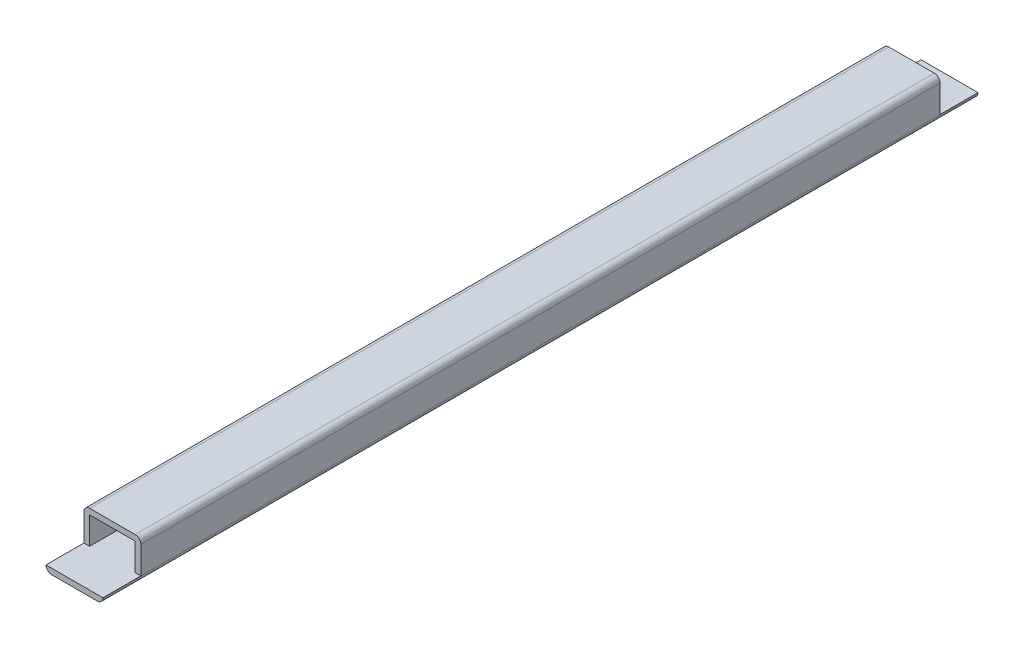
ISO-10303-21;
HEADER;
FILE_DESCRIPTION(('STEP AP214'),'2;1');
FILE_NAME('part.step','',(''),(''),'','','');
FILE_SCHEMA(('AUTOMOTIVE_DESIGN { 1 0 10303 214 1 1 1 1 }'));
ENDSEC;
DATA;
#1=APPLICATION_CONTEXT('core data for automotive mechanical design processes');
#2=APPLICATION_PROTOCOL_DEFINITION('international standard','automotive_design',2000,#1);
#3=PRODUCT_CONTEXT('',#1,'mechanical');
#4=PRODUCT('Part','Part','',(#3));
#5=PRODUCT_RELATED_PRODUCT_CATEGORY('part','',(#4));
#6=PRODUCT_DEFINITION_FORMATION('','',#4);
#7=PRODUCT_DEFINITION_CONTEXT('part definition',#1,'design');
#8=PRODUCT_DEFINITION('design','',#6,#7);
#9=PRODUCT_DEFINITION_SHAPE('','',#8);
#10=(LENGTH_UNIT() NAMED_UNIT(*) SI_UNIT(.MILLI.,.METRE.));
#11=(NAMED_UNIT(*) PLANE_ANGLE_UNIT() SI_UNIT($,.RADIAN.));
#12=(NAMED_UNIT(*) SI_UNIT($,.STERADIAN.) SOLID_ANGLE_UNIT());
#13=UNCERTAINTY_MEASURE_WITH_UNIT(LENGTH_MEASURE(1.E-05),#10,'distance_accuracy_value','');
#14=(GEOMETRIC_REPRESENTATION_CONTEXT(3) GLOBAL_UNCERTAINTY_ASSIGNED_CONTEXT((#13)) GLOBAL_UNIT_ASSIGNED_CONTEXT((#10,
#11,#12)) REPRESENTATION_CONTEXT('',''));
#15=CARTESIAN_POINT('',(0.,0.,0.));
#16=DIRECTION('',(0.,0.,1.));
#17=DIRECTION('',(1.,0.,0.));
#18=AXIS2_PLACEMENT_3D('',#15,#16,#17);
#19=CARTESIAN_POINT('',(3.,17.34,461.));
#20=DIRECTION('',(0.,0.,-1.));
#21=DIRECTION('',(-1.,0.,0.));
#22=AXIS2_PLACEMENT_3D('',#19,#20,#21);
#23=CYLINDRICAL_SURFACE('',#22,3.);
#24=CARTESIAN_POINT('',(3.,17.34,20.));
#25=DIRECTION('',(0.,0.,-1.));
#26=DIRECTION('',(-1.,0.,0.));
#27=AXIS2_PLACEMENT_3D('',#24,#25,#26);
#28=CIRCLE('',#27,3.);
#29=CARTESIAN_POINT('',(0.,17.34,20.));
#30=VERTEX_POINT('',#29);
#31=CARTESIAN_POINT('',(3.,20.34,20.));
#32=VERTEX_POINT('',#31);
#33=EDGE_CURVE('E243',#30,#32,#28,.T.);
#34=ORIENTED_EDGE('',*,*,#33,.F.);
#35=DIRECTION('',(0.,0.,-1.));
#36=VECTOR('',#35,1.);
#37=CARTESIAN_POINT('',(0.,17.34,461.));
#38=LINE('',#37,#36);
#39=CARTESIAN_POINT('',(0.,17.34,441.));
#40=VERTEX_POINT('',#39);
#41=EDGE_CURVE('E11',#40,#30,#38,.T.);
#42=ORIENTED_EDGE('',*,*,#41,.F.);
#43=CARTESIAN_POINT('',(3.,17.34,441.));
#44=DIRECTION('',(0.,0.,1.));
#45=DIRECTION('',(-1.,0.,0.));
#46=AXIS2_PLACEMENT_3D('',#43,#44,#45);
#47=CIRCLE('',#46,3.);
#48=CARTESIAN_POINT('',(3.,20.34,441.));
#49=VERTEX_POINT('',#48);
#50=EDGE_CURVE('E285',#49,#40,#47,.T.);
#51=ORIENTED_EDGE('',*,*,#50,.F.);
#52=DIRECTION('',(0.,0.,-1.));
#53=VECTOR('',#52,1.);
#54=CARTESIAN_POINT('',(3.,20.34,461.));
#55=LINE('',#54,#53);
#56=EDGE_CURVE('E189',#49,#32,#55,.T.);
#57=ORIENTED_EDGE('',*,*,#56,.T.);
#58=EDGE_LOOP('',(#34,#42,#51,#57));
#59=FACE_BOUND('',#58,.T.);
#60=ADVANCED_FACE('F42',(#59),#23,.T.);
#61=CARTESIAN_POINT('',(0.,3.00000000000002,461.));
#62=DIRECTION('',(1.,0.,0.));
#63=DIRECTION('',(0.,0.,-1.));
#64=AXIS2_PLACEMENT_3D('',#61,#62,#63);
#65=PLANE('',#64);
#66=DIRECTION('',(0.,1.,0.));
#67=VECTOR('',#66,1.);
#68=CARTESIAN_POINT('',(0.,3.00000000000002,20.));
#69=LINE('',#68,#67);
#70=CARTESIAN_POINT('',(0.,3.00000000000002,20.));
#71=VERTEX_POINT('',#70);
#72=EDGE_CURVE('E239',#71,#30,#69,.T.);
#73=ORIENTED_EDGE('',*,*,#72,.F.);
#74=DIRECTION('',(0.,0.,-1.));
#75=VECTOR('',#74,1.);
#76=CARTESIAN_POINT('',(0.,3.00000000000002,461.));
#77=LINE('',#76,#75);
#78=CARTESIAN_POINT('',(0.,3.00000000000002,441.));
#79=VERTEX_POINT('',#78);
#80=EDGE_CURVE('E220',#79,#71,#77,.T.);
#81=ORIENTED_EDGE('',*,*,#80,.F.);
#82=DIRECTION('',(0.,-1.,0.));
#83=VECTOR('',#82,1.);
#84=CARTESIAN_POINT('',(0.,3.00000000000002,441.));
#85=LINE('',#84,#83);
#86=EDGE_CURVE('E237',#40,#79,#85,.T.);
#87=ORIENTED_EDGE('',*,*,#86,.F.);
#88=ORIENTED_EDGE('',*,*,#41,.T.);
#89=EDGE_LOOP('',(#73,#81,#87,#88));
#90=FACE_BOUND('',#89,.T.);
#91=ADVANCED_FACE('F236',(#90),#65,.F.);
#92=CARTESIAN_POINT('',(30.,3.00000000000002,461.));
#93=DIRECTION('',(-1.,0.,0.));
#94=DIRECTION('',(0.,0.,1.));
#95=AXIS2_PLACEMENT_3D('',#92,#93,#94);
#96=PLANE('',#95);
#97=DIRECTION('',(0.,-1.,0.));
#98=VECTOR('',#97,1.);
#99=CARTESIAN_POINT('',(30.,17.34,20.));
#100=LINE('',#99,#98);
#101=CARTESIAN_POINT('',(30.,17.34,20.));
#102=VERTEX_POINT('',#101);
#103=CARTESIAN_POINT('',(30.,3.00000000000002,20.));
#104=VERTEX_POINT('',#103);
#105=EDGE_CURVE('E144',#102,#104,#100,.T.);
#106=ORIENTED_EDGE('',*,*,#105,.F.);
#107=DIRECTION('',(0.,0.,-1.));
#108=VECTOR('',#107,1.);
#109=CARTESIAN_POINT('',(30.,17.34,461.));
#110=LINE('',#109,#108);
#111=CARTESIAN_POINT('',(30.,17.34,441.));
#112=VERTEX_POINT('',#111);
#113=EDGE_CURVE('E205',#112,#102,#110,.T.);
#114=ORIENTED_EDGE('',*,*,#113,.F.);
#115=DIRECTION('',(0.,1.,0.));
#116=VECTOR('',#115,1.);
#117=CARTESIAN_POINT('',(30.,17.34,441.));
#118=LINE('',#117,#116);
#119=CARTESIAN_POINT('',(30.,3.00000000000002,441.));
#120=VERTEX_POINT('',#119);
#121=EDGE_CURVE('E276',#120,#112,#118,.T.);
#122=ORIENTED_EDGE('',*,*,#121,.F.);
#123=DIRECTION('',(0.,0.,-1.));
#124=VECTOR('',#123,1.);
#125=CARTESIAN_POINT('',(30.,3.00000000000002,461.));
#126=LINE('',#125,#124);
#127=EDGE_CURVE('E209',#120,#104,#126,.T.);
#128=ORIENTED_EDGE('',*,*,#127,.T.);
#129=EDGE_LOOP('',(#106,#114,#122,#128));
#130=FACE_BOUND('',#129,.T.);
#131=ADVANCED_FACE('F341',(#130),#96,.F.);
#132=CARTESIAN_POINT('',(27.,17.34,461.));
#133=DIRECTION('',(0.,0.,-1.));
#134=DIRECTION('',(-1.,0.,0.));
#135=AXIS2_PLACEMENT_3D('',#132,#133,#134);
#136=CYLINDRICAL_SURFACE('',#135,3.);
#137=CARTESIAN_POINT('',(27.,17.34,20.));
#138=DIRECTION('',(0.,0.,-1.));
#139=DIRECTION('',(-1.,0.,0.));
#140=AXIS2_PLACEMENT_3D('',#137,#138,#139);
#141=CIRCLE('',#140,3.00000000000002);
#142=CARTESIAN_POINT('',(27.,20.34,20.));
#143=VERTEX_POINT('',#142);
#144=EDGE_CURVE('E256',#143,#102,#141,.T.);
#145=ORIENTED_EDGE('',*,*,#144,.F.);
#146=DIRECTION('',(0.,0.,-1.));
#147=VECTOR('',#146,1.);
#148=CARTESIAN_POINT('',(27.,20.34,461.));
#149=LINE('',#148,#147);
#150=CARTESIAN_POINT('',(27.,20.34,441.));
#151=VERTEX_POINT('',#150);
#152=EDGE_CURVE('E201',#151,#143,#149,.T.);
#153=ORIENTED_EDGE('',*,*,#152,.F.);
#154=CARTESIAN_POINT('',(27.,17.34,441.));
#155=DIRECTION('',(0.,0.,1.));
#156=DIRECTION('',(-1.,0.,0.));
#157=AXIS2_PLACEMENT_3D('',#154,#155,#156);
#158=CIRCLE('',#157,3.00000000000002);
#159=EDGE_CURVE('E279',#112,#151,#158,.T.);
#160=ORIENTED_EDGE('',*,*,#159,.F.);
#161=ORIENTED_EDGE('',*,*,#113,.T.);
#162=EDGE_LOOP('',(#145,#153,#160,#161));
#163=FACE_BOUND('',#162,.T.);
#164=ADVANCED_FACE('F336',(#163),#136,.T.);
#165=CARTESIAN_POINT('',(3.,20.34,461.));
#166=DIRECTION('',(0.,-1.,0.));
#167=DIRECTION('',(1.,0.,0.));
#168=AXIS2_PLACEMENT_3D('',#165,#166,#167);
#169=PLANE('',#168);
#170=DIRECTION('',(1.,0.,0.));
#171=VECTOR('',#170,1.);
#172=CARTESIAN_POINT('',(3.,20.34,20.));
#173=LINE('',#172,#171);
#174=EDGE_CURVE('E248',#32,#143,#173,.T.);
#175=ORIENTED_EDGE('',*,*,#174,.F.);
#176=ORIENTED_EDGE('',*,*,#56,.F.);
#177=DIRECTION('',(-1.,0.,0.));
#178=VECTOR('',#177,1.);
#179=CARTESIAN_POINT('',(3.,20.34,441.));
#180=LINE('',#179,#178);
#181=EDGE_CURVE('E282',#151,#49,#180,.T.);
#182=ORIENTED_EDGE('',*,*,#181,.F.);
#183=ORIENTED_EDGE('',*,*,#152,.T.);
#184=EDGE_LOOP('',(#175,#176,#182,#183));
#185=FACE_BOUND('',#184,.T.);
#186=ADVANCED_FACE('F332',(#185),#169,.F.);
#187=CARTESIAN_POINT('',(3.,3.,461.));
#188=DIRECTION('',(1.,0.,0.));
#189=DIRECTION('',(0.,1.,0.));
#190=AXIS2_PLACEMENT_3D('',#187,#188,#189);
#191=PLANE('',#190);
#192=DIRECTION('',(0.,0.,-1.));
#193=VECTOR('',#192,1.);
#194=CARTESIAN_POINT('',(3.,3.,461.));
#195=LINE('',#194,#193);
#196=CARTESIAN_POINT('',(3.,3.,441.));
#197=VERTEX_POINT('',#196);
#198=CARTESIAN_POINT('',(3.,3.,20.));
#199=VERTEX_POINT('',#198);
#200=EDGE_CURVE('E167',#197,#199,#195,.T.);
#201=ORIENTED_EDGE('',*,*,#200,.T.);
#202=DIRECTION('',(0.,-1.,0.));
#203=VECTOR('',#202,1.);
#204=CARTESIAN_POINT('',(3.,17.34,20.));
#205=LINE('',#204,#203);
#206=CARTESIAN_POINT('',(3.,17.34,20.));
#207=VERTEX_POINT('',#206);
#208=EDGE_CURVE('E250',#207,#199,#205,.T.);
#209=ORIENTED_EDGE('',*,*,#208,.F.);
#210=DIRECTION('',(0.,0.,-1.));
#211=VECTOR('',#210,1.);
#212=CARTESIAN_POINT('',(3.,17.34,461.));
#213=LINE('',#212,#211);
#214=CARTESIAN_POINT('',(3.,17.34,441.));
#215=VERTEX_POINT('',#214);
#216=EDGE_CURVE('E174',#215,#207,#213,.T.);
#217=ORIENTED_EDGE('',*,*,#216,.F.);
#218=DIRECTION('',(0.,1.,0.));
#219=VECTOR('',#218,1.);
#220=CARTESIAN_POINT('',(3.,17.34,441.));
#221=LINE('',#220,#219);
#222=EDGE_CURVE('E65',#197,#215,#221,.T.);
#223=ORIENTED_EDGE('',*,*,#222,.F.);
#224=EDGE_LOOP('',(#201,#209,#217,#223));
#225=FACE_BOUND('',#224,.T.);
#226=ADVANCED_FACE('F305',(#225),#191,.T.);
#227=CARTESIAN_POINT('',(27.,17.34,461.));
#228=DIRECTION('',(-1.,0.,0.));
#229=DIRECTION('',(0.,0.,1.));
#230=AXIS2_PLACEMENT_3D('',#227,#228,#229);
#231=PLANE('',#230);
#232=DIRECTION('',(0.,0.,-1.));
#233=VECTOR('',#232,1.);
#234=CARTESIAN_POINT('',(27.,17.34,461.));
#235=LINE('',#234,#233);
#236=CARTESIAN_POINT('',(27.,17.34,441.));
#237=VERTEX_POINT('',#236);
#238=CARTESIAN_POINT('',(27.,17.34,20.));
#239=VERTEX_POINT('',#238);
#240=EDGE_CURVE('E158',#237,#239,#235,.T.);
#241=ORIENTED_EDGE('',*,*,#240,.T.);
#242=DIRECTION('',(0.,1.,0.));
#243=VECTOR('',#242,1.);
#244=CARTESIAN_POINT('',(27.,3.,20.));
#245=LINE('',#244,#243);
#246=CARTESIAN_POINT('',(27.,3.,20.));
#247=VERTEX_POINT('',#246);
#248=EDGE_CURVE('E57',#247,#239,#245,.T.);
#249=ORIENTED_EDGE('',*,*,#248,.F.);
#250=DIRECTION('',(0.,0.,-1.));
#251=VECTOR('',#250,1.);
#252=CARTESIAN_POINT('',(27.,3.,461.));
#253=LINE('',#252,#251);
#254=CARTESIAN_POINT('',(27.,3.,441.));
#255=VERTEX_POINT('',#254);
#256=EDGE_CURVE('E156',#255,#247,#253,.T.);
#257=ORIENTED_EDGE('',*,*,#256,.F.);
#258=DIRECTION('',(0.,-1.,0.));
#259=VECTOR('',#258,1.);
#260=CARTESIAN_POINT('',(27.,3.,441.));
#261=LINE('',#260,#259);
#262=EDGE_CURVE('E271',#237,#255,#261,.T.);
#263=ORIENTED_EDGE('',*,*,#262,.F.);
#264=EDGE_LOOP('',(#241,#249,#257,#263));
#265=FACE_BOUND('',#264,.T.);
#266=ADVANCED_FACE('F154',(#265),#231,.T.);
#267=CARTESIAN_POINT('',(3.,17.34,461.));
#268=DIRECTION('',(0.,-1.,0.));
#269=DIRECTION('',(0.,0.,-1.));
#270=AXIS2_PLACEMENT_3D('',#267,#268,#269);
#271=PLANE('',#270);
#272=ORIENTED_EDGE('',*,*,#216,.T.);
#273=DIRECTION('',(-1.,0.,0.));
#274=VECTOR('',#273,1.);
#275=CARTESIAN_POINT('',(27.,17.34,20.));
#276=LINE('',#275,#274);
#277=EDGE_CURVE('E160',#239,#207,#276,.T.);
#278=ORIENTED_EDGE('',*,*,#277,.F.);
#279=ORIENTED_EDGE('',*,*,#240,.F.);
#280=DIRECTION('',(1.,0.,0.));
#281=VECTOR('',#280,1.);
#282=CARTESIAN_POINT('',(27.,17.34,441.));
#283=LINE('',#282,#281);
#284=EDGE_CURVE('E268',#215,#237,#283,.T.);
#285=ORIENTED_EDGE('',*,*,#284,.F.);
#286=EDGE_LOOP('',(#272,#278,#279,#285));
#287=FACE_BOUND('',#286,.T.);
#288=ADVANCED_FACE('F302',(#287),#271,.T.);
#289=CARTESIAN_POINT('',(3.,17.34,461.));
#290=DIRECTION('',(0.,0.,1.));
#291=DIRECTION('',(1.,0.,0.));
#292=AXIS2_PLACEMENT_3D('',#289,#290,#291);
#293=PLANE('',#292);
#294=DIRECTION('',(1.,0.,0.));
#295=VECTOR('',#294,1.);
#296=CARTESIAN_POINT('',(27.,3.,461.));
#297=LINE('',#296,#295);
#298=CARTESIAN_POINT('',(0.,3.00000000000002,461.));
#299=VERTEX_POINT('',#298);
#300=CARTESIAN_POINT('',(30.,3.00000000000002,461.));
#301=VERTEX_POINT('',#300);
#302=EDGE_CURVE('E294',#299,#301,#297,.T.);
#303=ORIENTED_EDGE('',*,*,#302,.F.);
#304=CARTESIAN_POINT('',(3.,3.,461.));
#305=DIRECTION('',(0.,0.,1.));
#306=DIRECTION('',(1.,0.,0.));
#307=AXIS2_PLACEMENT_3D('',#304,#305,#306);
#308=CIRCLE('',#307,3.);
#309=CARTESIAN_POINT('',(3.00000000000002,0.,461.));
#310=VERTEX_POINT('',#309);
#311=EDGE_CURVE('E178',#299,#310,#308,.T.);
#312=ORIENTED_EDGE('',*,*,#311,.T.);
#313=DIRECTION('',(1.,0.,0.));
#314=VECTOR('',#313,1.);
#315=CARTESIAN_POINT('',(3.00000000000002,0.,461.));
#316=LINE('',#315,#314);
#317=CARTESIAN_POINT('',(27.,0.,461.));
#318=VERTEX_POINT('',#317);
#319=EDGE_CURVE('E181',#310,#318,#316,.T.);
#320=ORIENTED_EDGE('',*,*,#319,.T.);
#321=CARTESIAN_POINT('',(27.,3.,461.));
#322=DIRECTION('',(0.,0.,1.));
#323=DIRECTION('',(1.,0.,0.));
#324=AXIS2_PLACEMENT_3D('',#321,#322,#323);
#325=CIRCLE('',#324,3.);
#326=EDGE_CURVE('E185',#318,#301,#325,.T.);
#327=ORIENTED_EDGE('',*,*,#326,.T.);
#328=EDGE_LOOP('',(#303,#312,#320,#327));
#329=FACE_BOUND('',#328,.T.);
#330=ADVANCED_FACE('F323',(#329),#293,.T.);
#331=CARTESIAN_POINT('',(3.,17.34,0.));
#332=DIRECTION('',(0.,0.,1.));
#333=DIRECTION('',(1.,0.,0.));
#334=AXIS2_PLACEMENT_3D('',#331,#332,#333);
#335=PLANE('',#334);
#336=DIRECTION('',(1.,0.,0.));
#337=VECTOR('',#336,1.);
#338=CARTESIAN_POINT('',(27.,3.,0.));
#339=LINE('',#338,#337);
#340=CARTESIAN_POINT('',(0.,3.00000000000002,0.));
#341=VERTEX_POINT('',#340);
#342=CARTESIAN_POINT('',(30.,3.00000000000002,0.));
#343=VERTEX_POINT('',#342);
#344=EDGE_CURVE('E293',#341,#343,#339,.T.);
#345=ORIENTED_EDGE('',*,*,#344,.T.);
#346=CARTESIAN_POINT('',(27.,3.,0.));
#347=DIRECTION('',(0.,0.,1.));
#348=DIRECTION('',(1.,0.,0.));
#349=AXIS2_PLACEMENT_3D('',#346,#347,#348);
#350=CIRCLE('',#349,3.);
#351=CARTESIAN_POINT('',(27.,0.,0.));
#352=VERTEX_POINT('',#351);
#353=EDGE_CURVE('E182',#352,#343,#350,.T.);
#354=ORIENTED_EDGE('',*,*,#353,.F.);
#355=DIRECTION('',(1.,0.,0.));
#356=VECTOR('',#355,1.);
#357=CARTESIAN_POINT('',(3.00000000000002,0.,0.));
#358=LINE('',#357,#356);
#359=CARTESIAN_POINT('',(3.00000000000002,0.,0.));
#360=VERTEX_POINT('',#359);
#361=EDGE_CURVE('E192',#360,#352,#358,.T.);
#362=ORIENTED_EDGE('',*,*,#361,.F.);
#363=CARTESIAN_POINT('',(3.,3.,0.));
#364=DIRECTION('',(0.,0.,1.));
#365=DIRECTION('',(1.,0.,0.));
#366=AXIS2_PLACEMENT_3D('',#363,#364,#365);
#367=CIRCLE('',#366,3.);
#368=EDGE_CURVE('E172',#341,#360,#367,.T.);
#369=ORIENTED_EDGE('',*,*,#368,.F.);
#370=EDGE_LOOP('',(#345,#354,#362,#369));
#371=FACE_BOUND('',#370,.T.);
#372=ADVANCED_FACE('F314',(#371),#335,.F.);
#373=CARTESIAN_POINT('',(3.,3.,461.));
#374=DIRECTION('',(0.,0.,-1.));
#375=DIRECTION('',(-1.,0.,0.));
#376=AXIS2_PLACEMENT_3D('',#373,#374,#375);
#377=CYLINDRICAL_SURFACE('',#376,3.);
#378=ORIENTED_EDGE('',*,*,#368,.T.);
#379=DIRECTION('',(0.,0.,-1.));
#380=VECTOR('',#379,1.);
#381=CARTESIAN_POINT('',(3.00000000000002,0.,461.));
#382=LINE('',#381,#380);
#383=EDGE_CURVE('E217',#310,#360,#382,.T.);
#384=ORIENTED_EDGE('',*,*,#383,.F.);
#385=ORIENTED_EDGE('',*,*,#311,.F.);
#386=EDGE_CURVE('E50',#299,#79,#77,.T.);
#387=ORIENTED_EDGE('',*,*,#386,.T.);
#388=ORIENTED_EDGE('',*,*,#80,.T.);
#389=DIRECTION('',(0.,0.,-1.));
#390=VECTOR('',#389,1.);
#391=CARTESIAN_POINT('',(0.,3.00000000000002,20.));
#392=LINE('',#391,#390);
#393=EDGE_CURVE('E231',#71,#341,#392,.T.);
#394=ORIENTED_EDGE('',*,*,#393,.T.);
#395=EDGE_LOOP('',(#378,#384,#385,#387,#388,#394));
#396=FACE_BOUND('',#395,.T.);
#397=ADVANCED_FACE('F230',(#396),#377,.T.);
#398=CARTESIAN_POINT('',(3.00000000000002,0.,461.));
#399=DIRECTION('',(0.,1.,0.));
#400=DIRECTION('',(0.,0.,1.));
#401=AXIS2_PLACEMENT_3D('',#398,#399,#400);
#402=PLANE('',#401);
#403=ORIENTED_EDGE('',*,*,#361,.T.);
#404=DIRECTION('',(0.,0.,-1.));
#405=VECTOR('',#404,1.);
#406=CARTESIAN_POINT('',(27.,0.,461.));
#407=LINE('',#406,#405);
#408=EDGE_CURVE('E213',#318,#352,#407,.T.);
#409=ORIENTED_EDGE('',*,*,#408,.F.);
#410=ORIENTED_EDGE('',*,*,#319,.F.);
#411=ORIENTED_EDGE('',*,*,#383,.T.);
#412=EDGE_LOOP('',(#403,#409,#410,#411));
#413=FACE_BOUND('',#412,.T.);
#414=ADVANCED_FACE('F319',(#413),#402,.F.);
#415=CARTESIAN_POINT('',(27.,3.,461.));
#416=DIRECTION('',(0.,0.,-1.));
#417=DIRECTION('',(-1.,0.,0.));
#418=AXIS2_PLACEMENT_3D('',#415,#416,#417);
#419=CYLINDRICAL_SURFACE('',#418,3.);
#420=ORIENTED_EDGE('',*,*,#353,.T.);
#421=DIRECTION('',(0.,0.,-1.));
#422=VECTOR('',#421,1.);
#423=CARTESIAN_POINT('',(30.,3.00000000000002,20.));
#424=LINE('',#423,#422);
#425=EDGE_CURVE('E261',#104,#343,#424,.T.);
#426=ORIENTED_EDGE('',*,*,#425,.F.);
#427=ORIENTED_EDGE('',*,*,#127,.F.);
#428=EDGE_CURVE('E210',#301,#120,#126,.T.);
#429=ORIENTED_EDGE('',*,*,#428,.F.);
#430=ORIENTED_EDGE('',*,*,#326,.F.);
#431=ORIENTED_EDGE('',*,*,#408,.T.);
#432=EDGE_LOOP('',(#420,#426,#427,#429,#430,#431));
#433=FACE_BOUND('',#432,.T.);
#434=ADVANCED_FACE('F346',(#433),#419,.T.);
#435=CARTESIAN_POINT('',(27.,3.,461.));
#436=DIRECTION('',(0.,1.,0.));
#437=DIRECTION('',(0.,0.,1.));
#438=AXIS2_PLACEMENT_3D('',#435,#436,#437);
#439=PLANE('',#438);
#440=ORIENTED_EDGE('',*,*,#344,.F.);
#441=ORIENTED_EDGE('',*,*,#393,.F.);
#442=DIRECTION('',(-1.,0.,0.));
#443=VECTOR('',#442,1.);
#444=CARTESIAN_POINT('',(3.,3.,20.));
#445=LINE('',#444,#443);
#446=EDGE_CURVE('E244',#199,#71,#445,.T.);
#447=ORIENTED_EDGE('',*,*,#446,.F.);
#448=ORIENTED_EDGE('',*,*,#200,.F.);
#449=DIRECTION('',(1.,0.,0.));
#450=VECTOR('',#449,1.);
#451=CARTESIAN_POINT('',(3.,3.,441.));
#452=LINE('',#451,#450);
#453=EDGE_CURVE('E290',#79,#197,#452,.T.);
#454=ORIENTED_EDGE('',*,*,#453,.F.);
#455=ORIENTED_EDGE('',*,*,#386,.F.);
#456=ORIENTED_EDGE('',*,*,#302,.T.);
#457=ORIENTED_EDGE('',*,*,#428,.T.);
#458=DIRECTION('',(1.,0.,0.));
#459=VECTOR('',#458,1.);
#460=CARTESIAN_POINT('',(30.,3.00000000000002,441.));
#461=LINE('',#460,#459);
#462=EDGE_CURVE('E164',#255,#120,#461,.T.);
#463=ORIENTED_EDGE('',*,*,#462,.F.);
#464=ORIENTED_EDGE('',*,*,#256,.T.);
#465=DIRECTION('',(-1.,0.,0.));
#466=VECTOR('',#465,1.);
#467=CARTESIAN_POINT('',(30.,3.00000000000002,20.));
#468=LINE('',#467,#466);
#469=EDGE_CURVE('E141',#104,#247,#468,.T.);
#470=ORIENTED_EDGE('',*,*,#469,.F.);
#471=ORIENTED_EDGE('',*,*,#425,.T.);
#472=EDGE_LOOP('',(#440,#441,#447,#448,#454,#455,#456,#457,#463,#464,#470,#471));
#473=FACE_BOUND('',#472,.T.);
#474=ADVANCED_FACE('F162',(#473),#439,.T.);
#475=CARTESIAN_POINT('',(3.,17.34,441.));
#476=DIRECTION('',(0.,0.,-1.));
#477=DIRECTION('',(-1.,0.,0.));
#478=AXIS2_PLACEMENT_3D('',#475,#476,#477);
#479=PLANE('',#478);
#480=ORIENTED_EDGE('',*,*,#222,.T.);
#481=ORIENTED_EDGE('',*,*,#284,.T.);
#482=ORIENTED_EDGE('',*,*,#262,.T.);
#483=ORIENTED_EDGE('',*,*,#462,.T.);
#484=ORIENTED_EDGE('',*,*,#121,.T.);
#485=ORIENTED_EDGE('',*,*,#159,.T.);
#486=ORIENTED_EDGE('',*,*,#181,.T.);
#487=ORIENTED_EDGE('',*,*,#50,.T.);
#488=ORIENTED_EDGE('',*,*,#86,.T.);
#489=ORIENTED_EDGE('',*,*,#453,.T.);
#490=EDGE_LOOP('',(#480,#481,#482,#483,#484,#485,#486,#487,#488,#489));
#491=FACE_BOUND('',#490,.T.);
#492=ADVANCED_FACE('F325',(#491),#479,.F.);
#493=CARTESIAN_POINT('',(3.,17.34,20.));
#494=DIRECTION('',(0.,0.,-1.));
#495=DIRECTION('',(-1.,0.,0.));
#496=AXIS2_PLACEMENT_3D('',#493,#494,#495);
#497=PLANE('',#496);
#498=ORIENTED_EDGE('',*,*,#469,.T.);
#499=ORIENTED_EDGE('',*,*,#248,.T.);
#500=ORIENTED_EDGE('',*,*,#277,.T.);
#501=ORIENTED_EDGE('',*,*,#208,.T.);
#502=ORIENTED_EDGE('',*,*,#446,.T.);
#503=ORIENTED_EDGE('',*,*,#72,.T.);
#504=ORIENTED_EDGE('',*,*,#33,.T.);
#505=ORIENTED_EDGE('',*,*,#174,.T.);
#506=ORIENTED_EDGE('',*,*,#144,.T.);
#507=ORIENTED_EDGE('',*,*,#105,.T.);
#508=EDGE_LOOP('',(#498,#499,#500,#501,#502,#503,#504,#505,#506,#507));
#509=FACE_BOUND('',#508,.T.);
#510=ADVANCED_FACE('F142',(#509),#497,.T.);
#511=CLOSED_SHELL('',(#60,#91,#131,#164,#186,#226,#266,#288,#330,#372,#397,#414,#434,#474,#492,#510));
#512=MANIFOLD_SOLID_BREP('B2',#511);
#513=ADVANCED_BREP_SHAPE_REPRESENTATION('',(#18,#512),#14);
#514=SHAPE_DEFINITION_REPRESENTATION(#9,#513);
ENDSEC;
END-ISO-10303-21;
